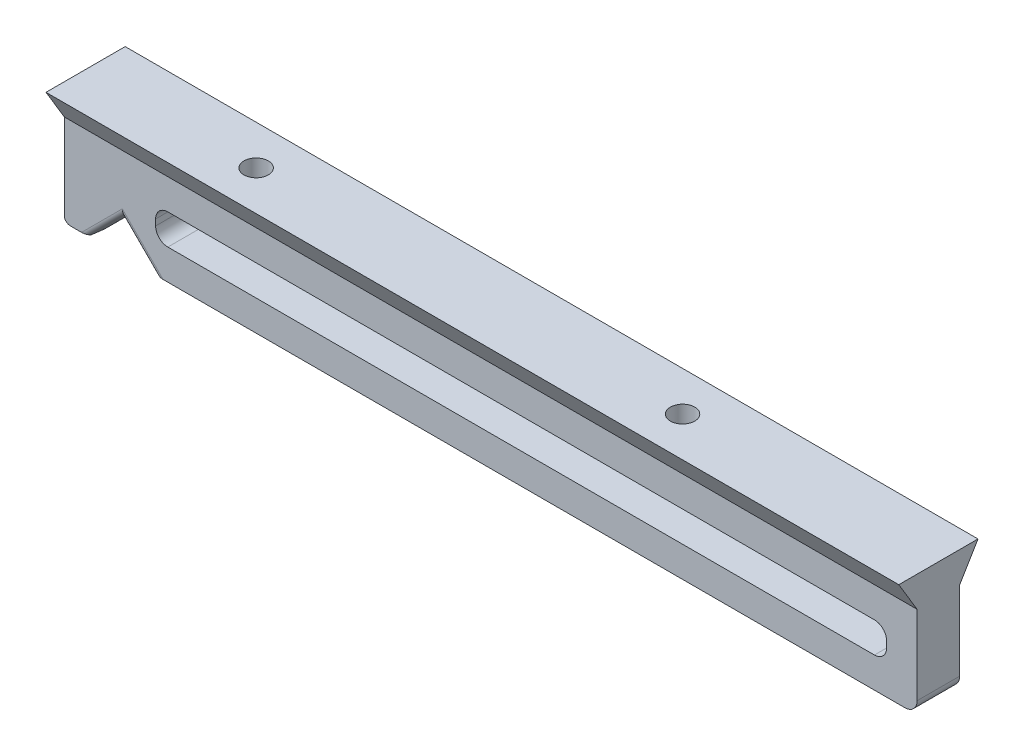
ISO-10303-21;
HEADER;
FILE_DESCRIPTION(('STEP AP214'),'2;1');
FILE_NAME('part.step','',(''),(''),'','','');
FILE_SCHEMA(('AUTOMOTIVE_DESIGN { 1 0 10303 214 1 1 1 1 }'));
ENDSEC;
DATA;
#1=APPLICATION_CONTEXT('core data for automotive mechanical design processes');
#2=APPLICATION_PROTOCOL_DEFINITION('international standard','automotive_design',2000,#1);
#3=PRODUCT_CONTEXT('',#1,'mechanical');
#4=PRODUCT('Part','Part','',(#3));
#5=PRODUCT_RELATED_PRODUCT_CATEGORY('part','',(#4));
#6=PRODUCT_DEFINITION_FORMATION('','',#4);
#7=PRODUCT_DEFINITION_CONTEXT('part definition',#1,'design');
#8=PRODUCT_DEFINITION('design','',#6,#7);
#9=PRODUCT_DEFINITION_SHAPE('','',#8);
#10=(LENGTH_UNIT() NAMED_UNIT(*) SI_UNIT(.MILLI.,.METRE.));
#11=(NAMED_UNIT(*) PLANE_ANGLE_UNIT() SI_UNIT($,.RADIAN.));
#12=(NAMED_UNIT(*) SI_UNIT($,.STERADIAN.) SOLID_ANGLE_UNIT());
#13=UNCERTAINTY_MEASURE_WITH_UNIT(LENGTH_MEASURE(1.E-05),#10,'distance_accuracy_value','');
#14=(GEOMETRIC_REPRESENTATION_CONTEXT(3) GLOBAL_UNCERTAINTY_ASSIGNED_CONTEXT((#13)) GLOBAL_UNIT_ASSIGNED_CONTEXT((#10,
#11,#12)) REPRESENTATION_CONTEXT('',''));
#15=CARTESIAN_POINT('',(0.,0.,0.));
#16=DIRECTION('',(0.,0.,1.));
#17=DIRECTION('',(1.,0.,0.));
#18=AXIS2_PLACEMENT_3D('',#15,#16,#17);
#19=CARTESIAN_POINT('',(-70.,20.,-3.5));
#20=DIRECTION('',(0.,0.,1.));
#21=DIRECTION('',(1.,0.,0.));
#22=AXIS2_PLACEMENT_3D('',#19,#20,#21);
#23=PLANE('',#22);
#24=DIRECTION('',(-1.,0.,0.));
#25=VECTOR('',#24,1.);
#26=CARTESIAN_POINT('',(65.,5.,-3.5));
#27=LINE('',#26,#25);
#28=CARTESIAN_POINT('',(63.,5.,-3.5));
#29=VERTEX_POINT('',#28);
#30=CARTESIAN_POINT('',(-53.,5.,-3.5));
#31=VERTEX_POINT('',#30);
#32=EDGE_CURVE('E523',#29,#31,#27,.T.);
#33=ORIENTED_EDGE('',*,*,#32,.F.);
#34=CARTESIAN_POINT('',(63.,7.,-3.5));
#35=DIRECTION('',(0.,0.,1.));
#36=DIRECTION('',(1.,0.,0.));
#37=AXIS2_PLACEMENT_3D('',#34,#35,#36);
#38=CIRCLE('',#37,2.);
#39=CARTESIAN_POINT('',(65.,7.,-3.5));
#40=VERTEX_POINT('',#39);
#41=EDGE_CURVE('E322',#29,#40,#38,.T.);
#42=ORIENTED_EDGE('',*,*,#41,.T.);
#43=DIRECTION('',(0.,-1.,0.));
#44=VECTOR('',#43,1.);
#45=CARTESIAN_POINT('',(65.,10.,-3.5));
#46=LINE('',#45,#44);
#47=CARTESIAN_POINT('',(65.,8.,-3.5));
#48=VERTEX_POINT('',#47);
#49=EDGE_CURVE('E517',#48,#40,#46,.T.);
#50=ORIENTED_EDGE('',*,*,#49,.F.);
#51=CARTESIAN_POINT('',(63.,8.,-3.5));
#52=DIRECTION('',(0.,0.,1.));
#53=DIRECTION('',(1.,0.,0.));
#54=AXIS2_PLACEMENT_3D('',#51,#52,#53);
#55=CIRCLE('',#54,2.);
#56=CARTESIAN_POINT('',(63.,10.,-3.5));
#57=VERTEX_POINT('',#56);
#58=EDGE_CURVE('E320',#48,#57,#55,.T.);
#59=ORIENTED_EDGE('',*,*,#58,.T.);
#60=DIRECTION('',(1.,0.,0.));
#61=VECTOR('',#60,1.);
#62=CARTESIAN_POINT('',(65.,10.,-3.5));
#63=LINE('',#62,#61);
#64=CARTESIAN_POINT('',(-53.,10.,-3.5));
#65=VERTEX_POINT('',#64);
#66=EDGE_CURVE('E385',#65,#57,#63,.T.);
#67=ORIENTED_EDGE('',*,*,#66,.F.);
#68=CARTESIAN_POINT('',(-53.,8.,-3.5));
#69=DIRECTION('',(0.,0.,1.));
#70=DIRECTION('',(1.,0.,0.));
#71=AXIS2_PLACEMENT_3D('',#68,#69,#70);
#72=CIRCLE('',#71,2.);
#73=CARTESIAN_POINT('',(-55.,8.,-3.5));
#74=VERTEX_POINT('',#73);
#75=EDGE_CURVE('E328',#65,#74,#72,.T.);
#76=ORIENTED_EDGE('',*,*,#75,.T.);
#77=DIRECTION('',(0.,1.,0.));
#78=VECTOR('',#77,1.);
#79=CARTESIAN_POINT('',(-55.,10.,-3.5));
#80=LINE('',#79,#78);
#81=CARTESIAN_POINT('',(-55.,7.,-3.5));
#82=VERTEX_POINT('',#81);
#83=EDGE_CURVE('E530',#82,#74,#80,.T.);
#84=ORIENTED_EDGE('',*,*,#83,.F.);
#85=CARTESIAN_POINT('',(-53.,7.,-3.5));
#86=DIRECTION('',(0.,0.,1.));
#87=DIRECTION('',(1.,0.,0.));
#88=AXIS2_PLACEMENT_3D('',#85,#86,#87);
#89=CIRCLE('',#88,2.);
#90=EDGE_CURVE('E323',#82,#31,#89,.T.);
#91=ORIENTED_EDGE('',*,*,#90,.T.);
#92=EDGE_LOOP('',(#33,#42,#50,#59,#67,#76,#84,#91));
#93=FACE_BOUND('',#92,.T.);
#94=DIRECTION('',(0.,-1.,0.));
#95=VECTOR('',#94,1.);
#96=CARTESIAN_POINT('',(70.,20.,-3.5));
#97=LINE('',#96,#95);
#98=CARTESIAN_POINT('',(70.,15.,-3.5));
#99=VERTEX_POINT('',#98);
#100=CARTESIAN_POINT('',(70.,2.,-3.5));
#101=VERTEX_POINT('',#100);
#102=EDGE_CURVE('E249',#99,#101,#97,.T.);
#103=ORIENTED_EDGE('',*,*,#102,.T.);
#104=CARTESIAN_POINT('',(68.,2.,-3.5));
#105=DIRECTION('',(0.,0.,1.));
#106=DIRECTION('',(1.,0.,0.));
#107=AXIS2_PLACEMENT_3D('',#104,#105,#106);
#108=CIRCLE('',#107,2.);
#109=CARTESIAN_POINT('',(68.,0.,-3.5));
#110=VERTEX_POINT('',#109);
#111=EDGE_CURVE('E62',#101,#110,#108,.F.);
#112=ORIENTED_EDGE('',*,*,#111,.T.);
#113=DIRECTION('',(-1.,0.,0.));
#114=VECTOR('',#113,1.);
#115=CARTESIAN_POINT('',(-70.,0.,-3.5));
#116=LINE('',#115,#114);
#117=CARTESIAN_POINT('',(-53.7757705796537,0.,-3.5));
#118=VERTEX_POINT('',#117);
#119=EDGE_CURVE('E364',#110,#118,#116,.T.);
#120=ORIENTED_EDGE('',*,*,#119,.T.);
#121=DIRECTION('',(-0.707106781186547,0.707106781186548,0.));
#122=VECTOR('',#121,1.);
#123=CARTESIAN_POINT('',(-71.8878852898269,18.1121147101732,-3.5));
#124=LINE('',#123,#122);
#125=CARTESIAN_POINT('',(-60.4736717274538,6.69790114780006,-3.5));
#126=VERTEX_POINT('',#125);
#127=EDGE_CURVE('E555',#118,#126,#124,.T.);
#128=ORIENTED_EDGE('',*,*,#127,.T.);
#129=DIRECTION('',(-0.707106781186548,-0.707106781186547,0.));
#130=VECTOR('',#129,1.);
#131=CARTESIAN_POINT('',(-58.5857864376269,8.5857864376269,-3.5));
#132=LINE('',#131,#130);
#133=CARTESIAN_POINT('',(-67.1715728752539,0.,-3.5));
#134=VERTEX_POINT('',#133);
#135=EDGE_CURVE('E554',#126,#134,#132,.T.);
#136=ORIENTED_EDGE('',*,*,#135,.T.);
#137=CARTESIAN_POINT('',(-69.,0.,-3.5));
#138=VERTEX_POINT('',#137);
#139=EDGE_CURVE('E366',#134,#138,#116,.T.);
#140=ORIENTED_EDGE('',*,*,#139,.T.);
#141=CARTESIAN_POINT('',(-69.,1.,-3.5));
#142=DIRECTION('',(0.,0.,1.));
#143=DIRECTION('',(1.,0.,0.));
#144=AXIS2_PLACEMENT_3D('',#141,#142,#143);
#145=CIRCLE('',#144,1.);
#146=CARTESIAN_POINT('',(-70.,1.,-3.5));
#147=VERTEX_POINT('',#146);
#148=EDGE_CURVE('E259',#138,#147,#145,.F.);
#149=ORIENTED_EDGE('',*,*,#148,.T.);
#150=DIRECTION('',(0.,-1.,0.));
#151=VECTOR('',#150,1.);
#152=CARTESIAN_POINT('',(-70.,20.,-3.5));
#153=LINE('',#152,#151);
#154=CARTESIAN_POINT('',(-70.,15.,-3.5));
#155=VERTEX_POINT('',#154);
#156=EDGE_CURVE('E348',#155,#147,#153,.T.);
#157=ORIENTED_EDGE('',*,*,#156,.F.);
#158=DIRECTION('',(-1.,0.,0.));
#159=VECTOR('',#158,1.);
#160=CARTESIAN_POINT('',(75.8309518948453,15.,-3.5));
#161=LINE('',#160,#159);
#162=EDGE_CURVE('E349',#99,#155,#161,.T.);
#163=ORIENTED_EDGE('',*,*,#162,.F.);
#164=EDGE_LOOP('',(#103,#112,#120,#128,#136,#140,#149,#157,#163));
#165=FACE_BOUND('',#164,.T.);
#166=ADVANCED_FACE('F39',(#93,#165),#23,.F.);
#167=CARTESIAN_POINT('',(0.,0.,0.));
#168=DIRECTION('',(0.,1.,0.));
#169=DIRECTION('',(0.,0.,1.));
#170=AXIS2_PLACEMENT_3D('',#167,#168,#169);
#171=PLANE('',#170);
#172=ORIENTED_EDGE('',*,*,#119,.F.);
#173=DIRECTION('',(0.,0.,-1.));
#174=VECTOR('',#173,1.);
#175=CARTESIAN_POINT('',(68.,0.,0.));
#176=LINE('',#175,#174);
#177=CARTESIAN_POINT('',(68.,0.,3.5));
#178=VERTEX_POINT('',#177);
#179=EDGE_CURVE('E50',#110,#178,#176,.F.);
#180=ORIENTED_EDGE('',*,*,#179,.T.);
#181=DIRECTION('',(1.,0.,0.));
#182=VECTOR('',#181,1.);
#183=CARTESIAN_POINT('',(-70.,0.,3.5));
#184=LINE('',#183,#182);
#185=CARTESIAN_POINT('',(-53.7757705796537,0.,3.5));
#186=VERTEX_POINT('',#185);
#187=EDGE_CURVE('E363',#186,#178,#184,.T.);
#188=ORIENTED_EDGE('',*,*,#187,.F.);
#189=CARTESIAN_POINT('',(-53.7757705796537,0.,2.5));
#190=DIRECTION('',(0.,1.,0.));
#191=DIRECTION('',(-1.,0.,0.));
#192=AXIS2_PLACEMENT_3D('',#189,#190,#191);
#193=ELLIPSE('',#192,1.41421356237309,1.);
#194=CARTESIAN_POINT('',(-55.0005154510453,0.,2.));
#195=VERTEX_POINT('',#194);
#196=EDGE_CURVE('E272',#186,#195,#193,.F.);
#197=ORIENTED_EDGE('',*,*,#196,.T.);
#198=CARTESIAN_POINT('',(-59.8994949366117,0.,0.));
#199=DIRECTION('',(0.,1.,0.));
#200=DIRECTION('',(-1.,0.,0.));
#201=AXIS2_PLACEMENT_3D('',#198,#199,#200);
#202=ELLIPSE('',#201,5.65685424949238,4.);
#203=CARTESIAN_POINT('',(-55.0005154510453,0.,-2.));
#204=VERTEX_POINT('',#203);
#205=EDGE_CURVE('E255',#195,#204,#202,.T.);
#206=ORIENTED_EDGE('',*,*,#205,.T.);
#207=CARTESIAN_POINT('',(-53.7757705796537,0.,-2.5));
#208=DIRECTION('',(0.,1.,0.));
#209=DIRECTION('',(-1.,0.,0.));
#210=AXIS2_PLACEMENT_3D('',#207,#208,#209);
#211=ELLIPSE('',#210,1.41421356237309,1.);
#212=EDGE_CURVE('E271',#204,#118,#211,.F.);
#213=ORIENTED_EDGE('',*,*,#212,.T.);
#214=EDGE_LOOP('',(#172,#180,#188,#197,#206,#213));
#215=FACE_BOUND('',#214,.T.);
#216=ADVANCED_FACE('F450',(#215),#171,.F.);
#217=CARTESIAN_POINT('',(70.,20.,-3.5));
#218=DIRECTION('',(-1.,0.,0.));
#219=DIRECTION('',(0.,0.,1.));
#220=AXIS2_PLACEMENT_3D('',#217,#218,#219);
#221=PLANE('',#220);
#222=DIRECTION('',(0.,-1.,0.));
#223=VECTOR('',#222,1.);
#224=CARTESIAN_POINT('',(70.,20.,3.5));
#225=LINE('',#224,#223);
#226=CARTESIAN_POINT('',(70.,15.,3.5));
#227=VERTEX_POINT('',#226);
#228=CARTESIAN_POINT('',(70.,2.,3.5));
#229=VERTEX_POINT('',#228);
#230=EDGE_CURVE('E341',#227,#229,#225,.T.);
#231=ORIENTED_EDGE('',*,*,#230,.T.);
#232=DIRECTION('',(0.,0.,-1.));
#233=VECTOR('',#232,1.);
#234=CARTESIAN_POINT('',(70.,2.,-3.5));
#235=LINE('',#234,#233);
#236=EDGE_CURVE('E334',#229,#101,#235,.T.);
#237=ORIENTED_EDGE('',*,*,#236,.T.);
#238=ORIENTED_EDGE('',*,*,#102,.F.);
#239=DIRECTION('',(0.,0.857492925712544,-0.514495755427526));
#240=VECTOR('',#239,1.);
#241=CARTESIAN_POINT('',(70.,20.,-6.5));
#242=LINE('',#241,#240);
#243=CARTESIAN_POINT('',(70.,20.,-6.5));
#244=VERTEX_POINT('',#243);
#245=EDGE_CURVE('E380',#99,#244,#242,.T.);
#246=ORIENTED_EDGE('',*,*,#245,.T.);
#247=DIRECTION('',(0.,0.,-1.));
#248=VECTOR('',#247,1.);
#249=CARTESIAN_POINT('',(70.,20.,-3.5));
#250=LINE('',#249,#248);
#251=CARTESIAN_POINT('',(70.,20.,6.5));
#252=VERTEX_POINT('',#251);
#253=EDGE_CURVE('E368',#252,#244,#250,.T.);
#254=ORIENTED_EDGE('',*,*,#253,.F.);
#255=DIRECTION('',(0.,-0.857492925712544,-0.514495755427526));
#256=VECTOR('',#255,1.);
#257=CARTESIAN_POINT('',(70.,20.,6.5));
#258=LINE('',#257,#256);
#259=EDGE_CURVE('E232',#252,#227,#258,.T.);
#260=ORIENTED_EDGE('',*,*,#259,.T.);
#261=EDGE_LOOP('',(#231,#237,#238,#246,#254,#260));
#262=FACE_BOUND('',#261,.T.);
#263=ADVANCED_FACE('F338',(#262),#221,.F.);
#264=CARTESIAN_POINT('',(-70.,20.,-3.5));
#265=DIRECTION('',(1.,0.,0.));
#266=DIRECTION('',(0.,0.,-1.));
#267=AXIS2_PLACEMENT_3D('',#264,#265,#266);
#268=PLANE('',#267);
#269=CARTESIAN_POINT('',(-70.,10.1005050633883,0.));
#270=DIRECTION('',(1.,0.,0.));
#271=DIRECTION('',(0.,1.,0.));
#272=AXIS2_PLACEMENT_3D('',#269,#270,#271);
#273=ELLIPSE('',#272,2.8284271247462,2.00000000000001);
#274=CARTESIAN_POINT('',(-70.,12.9289321881345,0.));
#275=VERTEX_POINT('',#274);
#276=EDGE_CURVE('E233',#275,#275,#273,.T.);
#277=ORIENTED_EDGE('',*,*,#276,.T.);
#278=EDGE_LOOP('',(#277));
#279=FACE_BOUND('',#278,.T.);
#280=ORIENTED_EDGE('',*,*,#156,.T.);
#281=DIRECTION('',(0.,0.,1.));
#282=VECTOR('',#281,1.);
#283=CARTESIAN_POINT('',(-70.,1.,-3.5));
#284=LINE('',#283,#282);
#285=CARTESIAN_POINT('',(-70.,1.,3.5));
#286=VERTEX_POINT('',#285);
#287=EDGE_CURVE('E213',#147,#286,#284,.T.);
#288=ORIENTED_EDGE('',*,*,#287,.T.);
#289=DIRECTION('',(0.,-1.,0.));
#290=VECTOR('',#289,1.);
#291=CARTESIAN_POINT('',(-70.,20.,3.5));
#292=LINE('',#291,#290);
#293=CARTESIAN_POINT('',(-70.,15.,3.5));
#294=VERTEX_POINT('',#293);
#295=EDGE_CURVE('E351',#294,#286,#292,.T.);
#296=ORIENTED_EDGE('',*,*,#295,.F.);
#297=DIRECTION('',(0.,0.857492925712544,0.514495755427526));
#298=VECTOR('',#297,1.);
#299=CARTESIAN_POINT('',(-70.,20.,6.5));
#300=LINE('',#299,#298);
#301=CARTESIAN_POINT('',(-70.,20.,6.5));
#302=VERTEX_POINT('',#301);
#303=EDGE_CURVE('E384',#294,#302,#300,.T.);
#304=ORIENTED_EDGE('',*,*,#303,.T.);
#305=DIRECTION('',(0.,0.,1.));
#306=VECTOR('',#305,1.);
#307=CARTESIAN_POINT('',(-70.,20.,-3.5));
#308=LINE('',#307,#306);
#309=CARTESIAN_POINT('',(-70.,20.,-6.5));
#310=VERTEX_POINT('',#309);
#311=EDGE_CURVE('E359',#310,#302,#308,.T.);
#312=ORIENTED_EDGE('',*,*,#311,.F.);
#313=DIRECTION('',(0.,-0.857492925712544,0.514495755427526));
#314=VECTOR('',#313,1.);
#315=CARTESIAN_POINT('',(-70.,20.,-6.5));
#316=LINE('',#315,#314);
#317=EDGE_CURVE('E387',#310,#155,#316,.T.);
#318=ORIENTED_EDGE('',*,*,#317,.T.);
#319=EDGE_LOOP('',(#280,#288,#296,#304,#312,#318));
#320=FACE_BOUND('',#319,.T.);
#321=ADVANCED_FACE('F448',(#279,#320),#268,.F.);
#322=CARTESIAN_POINT('',(-70.,20.,3.5));
#323=DIRECTION('',(0.,0.,-1.));
#324=DIRECTION('',(-1.,0.,0.));
#325=AXIS2_PLACEMENT_3D('',#322,#323,#324);
#326=PLANE('',#325);
#327=DIRECTION('',(0.,1.,0.));
#328=VECTOR('',#327,1.);
#329=CARTESIAN_POINT('',(-55.,20.,3.5));
#330=LINE('',#329,#328);
#331=CARTESIAN_POINT('',(-55.,7.,3.5));
#332=VERTEX_POINT('',#331);
#333=CARTESIAN_POINT('',(-55.,8.,3.5));
#334=VERTEX_POINT('',#333);
#335=EDGE_CURVE('E289',#332,#334,#330,.T.);
#336=ORIENTED_EDGE('',*,*,#335,.T.);
#337=CARTESIAN_POINT('',(-53.,8.,3.5));
#338=DIRECTION('',(0.,0.,-1.));
#339=DIRECTION('',(-1.,0.,0.));
#340=AXIS2_PLACEMENT_3D('',#337,#338,#339);
#341=CIRCLE('',#340,2.);
#342=CARTESIAN_POINT('',(-53.,10.,3.5));
#343=VERTEX_POINT('',#342);
#344=EDGE_CURVE('E331',#334,#343,#341,.T.);
#345=ORIENTED_EDGE('',*,*,#344,.T.);
#346=DIRECTION('',(1.,0.,0.));
#347=VECTOR('',#346,1.);
#348=CARTESIAN_POINT('',(-70.,10.,3.5));
#349=LINE('',#348,#347);
#350=CARTESIAN_POINT('',(63.,10.,3.5));
#351=VERTEX_POINT('',#350);
#352=EDGE_CURVE('E293',#343,#351,#349,.T.);
#353=ORIENTED_EDGE('',*,*,#352,.T.);
#354=CARTESIAN_POINT('',(63.,8.,3.5));
#355=DIRECTION('',(0.,0.,-1.));
#356=DIRECTION('',(-1.,0.,0.));
#357=AXIS2_PLACEMENT_3D('',#354,#355,#356);
#358=CIRCLE('',#357,2.);
#359=CARTESIAN_POINT('',(65.,8.,3.5));
#360=VERTEX_POINT('',#359);
#361=EDGE_CURVE('E316',#351,#360,#358,.T.);
#362=ORIENTED_EDGE('',*,*,#361,.T.);
#363=DIRECTION('',(0.,-1.,0.));
#364=VECTOR('',#363,1.);
#365=CARTESIAN_POINT('',(65.,20.,3.5));
#366=LINE('',#365,#364);
#367=CARTESIAN_POINT('',(65.,7.,3.5));
#368=VERTEX_POINT('',#367);
#369=EDGE_CURVE('E295',#360,#368,#366,.T.);
#370=ORIENTED_EDGE('',*,*,#369,.T.);
#371=CARTESIAN_POINT('',(63.,7.,3.5));
#372=DIRECTION('',(0.,0.,-1.));
#373=DIRECTION('',(-1.,0.,0.));
#374=AXIS2_PLACEMENT_3D('',#371,#372,#373);
#375=CIRCLE('',#374,2.);
#376=CARTESIAN_POINT('',(63.,5.,3.5));
#377=VERTEX_POINT('',#376);
#378=EDGE_CURVE('E324',#368,#377,#375,.T.);
#379=ORIENTED_EDGE('',*,*,#378,.T.);
#380=DIRECTION('',(-1.,0.,0.));
#381=VECTOR('',#380,1.);
#382=CARTESIAN_POINT('',(-70.,5.,3.5));
#383=LINE('',#382,#381);
#384=CARTESIAN_POINT('',(-53.,5.,3.5));
#385=VERTEX_POINT('',#384);
#386=EDGE_CURVE('E278',#377,#385,#383,.T.);
#387=ORIENTED_EDGE('',*,*,#386,.T.);
#388=CARTESIAN_POINT('',(-53.,7.,3.5));
#389=DIRECTION('',(0.,0.,-1.));
#390=DIRECTION('',(-1.,0.,0.));
#391=AXIS2_PLACEMENT_3D('',#388,#389,#390);
#392=CIRCLE('',#391,2.);
#393=EDGE_CURVE('E327',#385,#332,#392,.T.);
#394=ORIENTED_EDGE('',*,*,#393,.T.);
#395=EDGE_LOOP('',(#336,#345,#353,#362,#370,#379,#387,#394));
#396=FACE_BOUND('',#395,.T.);
#397=ORIENTED_EDGE('',*,*,#187,.T.);
#398=CARTESIAN_POINT('',(68.,2.,3.5));
#399=DIRECTION('',(0.,0.,-1.));
#400=DIRECTION('',(-1.,0.,0.));
#401=AXIS2_PLACEMENT_3D('',#398,#399,#400);
#402=CIRCLE('',#401,2.);
#403=EDGE_CURVE('E11',#178,#229,#402,.F.);
#404=ORIENTED_EDGE('',*,*,#403,.T.);
#405=ORIENTED_EDGE('',*,*,#230,.F.);
#406=DIRECTION('',(-1.,0.,0.));
#407=VECTOR('',#406,1.);
#408=CARTESIAN_POINT('',(75.8309518948453,15.,3.5));
#409=LINE('',#408,#407);
#410=EDGE_CURVE('E390',#227,#294,#409,.T.);
#411=ORIENTED_EDGE('',*,*,#410,.T.);
#412=ORIENTED_EDGE('',*,*,#295,.T.);
#413=CARTESIAN_POINT('',(-69.,1.,3.5));
#414=DIRECTION('',(0.,0.,-1.));
#415=DIRECTION('',(-1.,0.,0.));
#416=AXIS2_PLACEMENT_3D('',#413,#414,#415);
#417=CIRCLE('',#416,1.);
#418=CARTESIAN_POINT('',(-69.,0.,3.5));
#419=VERTEX_POINT('',#418);
#420=EDGE_CURVE('E546',#286,#419,#417,.F.);
#421=ORIENTED_EDGE('',*,*,#420,.T.);
#422=CARTESIAN_POINT('',(-67.1715728752539,0.,3.5));
#423=VERTEX_POINT('',#422);
#424=EDGE_CURVE('E361',#419,#423,#184,.T.);
#425=ORIENTED_EDGE('',*,*,#424,.T.);
#426=DIRECTION('',(0.707106781186548,0.707106781186547,0.));
#427=VECTOR('',#426,1.);
#428=CARTESIAN_POINT('',(-58.5857864376269,8.5857864376269,3.5));
#429=LINE('',#428,#427);
#430=CARTESIAN_POINT('',(-60.4736717274538,6.69790114780006,3.5));
#431=VERTEX_POINT('',#430);
#432=EDGE_CURVE('E545',#423,#431,#429,.T.);
#433=ORIENTED_EDGE('',*,*,#432,.T.);
#434=DIRECTION('',(-0.707106781186547,0.707106781186548,0.));
#435=VECTOR('',#434,1.);
#436=CARTESIAN_POINT('',(-71.8878852898269,18.1121147101732,3.5));
#437=LINE('',#436,#435);
#438=EDGE_CURVE('E565',#431,#186,#437,.F.);
#439=ORIENTED_EDGE('',*,*,#438,.T.);
#440=EDGE_LOOP('',(#397,#404,#405,#411,#412,#421,#425,#433,#439));
#441=FACE_BOUND('',#440,.T.);
#442=ADVANCED_FACE('F445',(#396,#441),#326,.F.);
#443=CARTESIAN_POINT('',(0.,20.,0.));
#444=DIRECTION('',(0.,1.,0.));
#445=DIRECTION('',(0.,0.,1.));
#446=AXIS2_PLACEMENT_3D('',#443,#444,#445);
#447=PLANE('',#446);
#448=CARTESIAN_POINT('',(-42.,20.,0.));
#449=DIRECTION('',(0.,1.,0.));
#450=DIRECTION('',(0.,0.,1.));
#451=AXIS2_PLACEMENT_3D('',#448,#449,#450);
#452=CIRCLE('',#451,2.);
#453=CARTESIAN_POINT('',(-42.,20.,2.));
#454=VERTEX_POINT('',#453);
#455=EDGE_CURVE('E376',#454,#454,#452,.T.);
#456=ORIENTED_EDGE('',*,*,#455,.F.);
#457=EDGE_LOOP('',(#456));
#458=FACE_BOUND('',#457,.T.);
#459=CARTESIAN_POINT('',(28.,20.,0.));
#460=DIRECTION('',(0.,1.,0.));
#461=DIRECTION('',(0.,0.,1.));
#462=AXIS2_PLACEMENT_3D('',#459,#460,#461);
#463=CIRCLE('',#462,2.);
#464=CARTESIAN_POINT('',(28.,20.,2.));
#465=VERTEX_POINT('',#464);
#466=EDGE_CURVE('E373',#465,#465,#463,.T.);
#467=ORIENTED_EDGE('',*,*,#466,.F.);
#468=EDGE_LOOP('',(#467));
#469=FACE_BOUND('',#468,.T.);
#470=ORIENTED_EDGE('',*,*,#253,.T.);
#471=DIRECTION('',(-1.,0.,0.));
#472=VECTOR('',#471,1.);
#473=CARTESIAN_POINT('',(75.8309518948453,20.,-6.5));
#474=LINE('',#473,#472);
#475=EDGE_CURVE('E395',#244,#310,#474,.T.);
#476=ORIENTED_EDGE('',*,*,#475,.T.);
#477=ORIENTED_EDGE('',*,*,#311,.T.);
#478=DIRECTION('',(-1.,0.,0.));
#479=VECTOR('',#478,1.);
#480=CARTESIAN_POINT('',(75.8309518948453,20.,6.5));
#481=LINE('',#480,#479);
#482=EDGE_CURVE('E389',#252,#302,#481,.T.);
#483=ORIENTED_EDGE('',*,*,#482,.F.);
#484=EDGE_LOOP('',(#470,#476,#477,#483));
#485=FACE_BOUND('',#484,.T.);
#486=ADVANCED_FACE('F437',(#458,#469,#485),#447,.T.);
#487=ORIENTED_EDGE('',*,*,#424,.F.);
#488=DIRECTION('',(0.,0.,1.));
#489=VECTOR('',#488,1.);
#490=CARTESIAN_POINT('',(-69.,0.,0.));
#491=LINE('',#490,#489);
#492=EDGE_CURVE('E549',#419,#138,#491,.F.);
#493=ORIENTED_EDGE('',*,*,#492,.T.);
#494=ORIENTED_EDGE('',*,*,#139,.F.);
#495=CARTESIAN_POINT('',(-67.1715728752539,0.,-2.5));
#496=DIRECTION('',(0.,1.,0.));
#497=DIRECTION('',(-1.,0.,0.));
#498=AXIS2_PLACEMENT_3D('',#495,#496,#497);
#499=ELLIPSE('',#498,1.4142135623731,1.);
#500=CARTESIAN_POINT('',(-66.036614644569,0.,-3.09660280530714));
#501=VERTEX_POINT('',#500);
#502=EDGE_CURVE('E541',#134,#501,#499,.F.);
#503=ORIENTED_EDGE('',*,*,#502,.T.);
#504=DIRECTION('',(0.,0.,1.));
#505=VECTOR('',#504,1.);
#506=CARTESIAN_POINT('',(-66.036614644569,0.,0.));
#507=LINE('',#506,#505);
#508=CARTESIAN_POINT('',(-66.036614644569,0.,3.09660280530713));
#509=VERTEX_POINT('',#508);
#510=EDGE_CURVE('E225',#501,#509,#507,.T.);
#511=ORIENTED_EDGE('',*,*,#510,.T.);
#512=CARTESIAN_POINT('',(-67.1715728752539,0.,2.5));
#513=DIRECTION('',(0.,1.,0.));
#514=DIRECTION('',(1.,0.,0.));
#515=AXIS2_PLACEMENT_3D('',#512,#513,#514);
#516=ELLIPSE('',#515,1.4142135623731,1.);
#517=EDGE_CURVE('E539',#509,#423,#516,.F.);
#518=ORIENTED_EDGE('',*,*,#517,.T.);
#519=EDGE_LOOP('',(#487,#493,#494,#503,#511,#518));
#520=FACE_BOUND('',#519,.T.);
#521=ADVANCED_FACE('F440',(#520),#171,.F.);
#522=CARTESIAN_POINT('',(28.,10.,0.));
#523=DIRECTION('',(0.,1.,0.));
#524=DIRECTION('',(0.,0.,1.));
#525=AXIS2_PLACEMENT_3D('',#522,#523,#524);
#526=CYLINDRICAL_SURFACE('',#525,2.);
#527=CARTESIAN_POINT('',(28.,10.,0.));
#528=DIRECTION('',(0.,1.,0.));
#529=DIRECTION('',(0.,0.,1.));
#530=AXIS2_PLACEMENT_3D('',#527,#528,#529);
#531=CIRCLE('',#530,2.);
#532=CARTESIAN_POINT('',(28.,10.,2.));
#533=VERTEX_POINT('',#532);
#534=EDGE_CURVE('E285',#533,#533,#531,.T.);
#535=ORIENTED_EDGE('',*,*,#534,.F.);
#536=EDGE_LOOP('',(#535));
#537=FACE_BOUND('',#536,.T.);
#538=ORIENTED_EDGE('',*,*,#466,.T.);
#539=EDGE_LOOP('',(#538));
#540=FACE_BOUND('',#539,.T.);
#541=ADVANCED_FACE('F433',(#537,#540),#526,.F.);
#542=CARTESIAN_POINT('',(-42.,10.,0.));
#543=DIRECTION('',(0.,1.,0.));
#544=DIRECTION('',(0.,0.,1.));
#545=AXIS2_PLACEMENT_3D('',#542,#543,#544);
#546=CYLINDRICAL_SURFACE('',#545,2.);
#547=CARTESIAN_POINT('',(-42.,10.,0.));
#548=DIRECTION('',(0.,1.,0.));
#549=DIRECTION('',(0.,0.,1.));
#550=AXIS2_PLACEMENT_3D('',#547,#548,#549);
#551=CIRCLE('',#550,2.);
#552=CARTESIAN_POINT('',(-42.,10.,2.));
#553=VERTEX_POINT('',#552);
#554=EDGE_CURVE('E375',#553,#553,#551,.T.);
#555=ORIENTED_EDGE('',*,*,#554,.F.);
#556=EDGE_LOOP('',(#555));
#557=FACE_BOUND('',#556,.T.);
#558=ORIENTED_EDGE('',*,*,#455,.T.);
#559=EDGE_LOOP('',(#558));
#560=FACE_BOUND('',#559,.T.);
#561=ADVANCED_FACE('F429',(#557,#560),#546,.F.);
#562=CARTESIAN_POINT('',(75.8309518948453,20.,6.5));
#563=DIRECTION('',(0.,-0.514495755427527,0.857492925712544));
#564=DIRECTION('',(0.,-0.857492925712544,-0.514495755427526));
#565=AXIS2_PLACEMENT_3D('',#562,#563,#564);
#566=PLANE('',#565);
#567=ORIENTED_EDGE('',*,*,#259,.F.);
#568=ORIENTED_EDGE('',*,*,#482,.T.);
#569=ORIENTED_EDGE('',*,*,#303,.F.);
#570=ORIENTED_EDGE('',*,*,#410,.F.);
#571=EDGE_LOOP('',(#567,#568,#569,#570));
#572=FACE_BOUND('',#571,.T.);
#573=ADVANCED_FACE('F424',(#572),#566,.T.);
#574=CARTESIAN_POINT('',(75.8309518948453,20.,-6.5));
#575=DIRECTION('',(0.,-0.514495755427527,-0.857492925712544));
#576=DIRECTION('',(0.,0.857492925712544,-0.514495755427526));
#577=AXIS2_PLACEMENT_3D('',#574,#575,#576);
#578=PLANE('',#577);
#579=ORIENTED_EDGE('',*,*,#245,.F.);
#580=ORIENTED_EDGE('',*,*,#162,.T.);
#581=ORIENTED_EDGE('',*,*,#317,.F.);
#582=ORIENTED_EDGE('',*,*,#475,.F.);
#583=EDGE_LOOP('',(#579,#580,#581,#582));
#584=FACE_BOUND('',#583,.T.);
#585=ADVANCED_FACE('F422',(#584),#578,.T.);
#586=CARTESIAN_POINT('',(5.05025253169412,-64.9497474683058,0.));
#587=DIRECTION('',(-0.707106781186548,0.707106781186548,0.));
#588=DIRECTION('',(-0.707106781186548,-0.707106781186547,0.));
#589=AXIS2_PLACEMENT_3D('',#586,#587,#588);
#590=CYLINDRICAL_SURFACE('',#589,2.00000000000001);
#591=CARTESIAN_POINT('',(-62.8284271247462,2.92893218813453,0.));
#592=DIRECTION('',(-0.707106781186547,0.707106781186548,0.));
#593=DIRECTION('',(-0.707106781186548,-0.707106781186547,0.));
#594=AXIS2_PLACEMENT_3D('',#591,#592,#593);
#595=CIRCLE('',#594,2.00000000000001);
#596=CARTESIAN_POINT('',(-64.1977335185091,1.55962579437162,-0.500000000000226));
#597=VERTEX_POINT('',#596);
#598=CARTESIAN_POINT('',(-64.1977335185091,1.55962579437162,0.500000000000226));
#599=VERTEX_POINT('',#598);
#600=EDGE_CURVE('E208',#597,#599,#595,.F.);
#601=ORIENTED_EDGE('',*,*,#600,.T.);
#602=CARTESIAN_POINT('',(-64.1977335185091,1.55962579437166,0.500000000000227));
#603=CARTESIAN_POINT('',(-64.2017805725702,1.55619331917412,0.479516962539039));
#604=CARTESIAN_POINT('',(-64.2055787759125,1.55297173501291,0.458949424054254));
#605=CARTESIAN_POINT('',(-64.2126691844545,1.54695758415615,0.417694732215152));
#606=CARTESIAN_POINT('',(-64.2159620797651,1.54416443234278,0.397007782766125));
#607=CARTESIAN_POINT('',(-64.2220405706567,1.53900844801786,0.355535585483894));
#608=CARTESIAN_POINT('',(-64.2248268568101,1.536645029725,0.334750511692076));
#609=CARTESIAN_POINT('',(-64.2298914419646,1.53234920005417,0.29310338353765));
#610=CARTESIAN_POINT('',(-64.2321704311119,1.53041620311333,0.272241473498304));
#611=CARTESIAN_POINT('',(-64.2362201835197,1.52698145509425,0.230461916079305));
#612=CARTESIAN_POINT('',(-64.2379916358456,1.52547911932054,0.209544383558041));
#613=CARTESIAN_POINT('',(-64.2410265636229,1.52290544483792,0.167674742806464));
#614=CARTESIAN_POINT('',(-64.2422907263563,1.52183352299781,0.146722720235463));
#615=CARTESIAN_POINT('',(-64.2443117954759,1.52011995607632,0.104805154033335));
#616=CARTESIAN_POINT('',(-64.245069386686,1.51947773009696,0.0838396671655369));
#617=CARTESIAN_POINT('',(-64.2460785027995,1.51862236508322,0.0419161013997034));
#618=CARTESIAN_POINT('',(-64.2463307094024,1.51840864804449,0.0209580506998517));
#619=CARTESIAN_POINT('',(-64.2463307094024,1.51840864804449,-0.0209580506998518));
#620=CARTESIAN_POINT('',(-64.2460785027995,1.51862236508322,-0.0419161013997035));
#621=CARTESIAN_POINT('',(-64.245069386686,1.51947773009696,-0.083839667165537));
#622=CARTESIAN_POINT('',(-64.2443117954759,1.52011995607632,-0.104805154033335));
#623=CARTESIAN_POINT('',(-64.2422907263563,1.52183352299781,-0.146722720235463));
#624=CARTESIAN_POINT('',(-64.2410265636229,1.52290544483792,-0.167674742806465));
#625=CARTESIAN_POINT('',(-64.2379916358456,1.52547911932054,-0.209544383558042));
#626=CARTESIAN_POINT('',(-64.2362201835197,1.52698145509425,-0.230461916079305));
#627=CARTESIAN_POINT('',(-64.2321704311119,1.53041620311333,-0.272241473498305));
#628=CARTESIAN_POINT('',(-64.2298914419646,1.53234920005417,-0.293103383537651));
#629=CARTESIAN_POINT('',(-64.2248268568101,1.536645029725,-0.334750511692076));
#630=CARTESIAN_POINT('',(-64.2220405706567,1.53900844801786,-0.355535585483894));
#631=CARTESIAN_POINT('',(-64.2159620797651,1.54416443234278,-0.397007782766125));
#632=CARTESIAN_POINT('',(-64.2126691844545,1.54695758415615,-0.417694732215153));
#633=CARTESIAN_POINT('',(-64.2055787759125,1.55297173501291,-0.458949424054254));
#634=CARTESIAN_POINT('',(-64.2017805725702,1.55619331917412,-0.479516962539039));
#635=CARTESIAN_POINT('',(-64.1977335185091,1.55962579437166,-0.500000000000227));
#636=B_SPLINE_CURVE_WITH_KNOTS('',3,(#602,#603,#604,#605,#606,#607,#608,#609,#610,#611,#612,
#613,#614,#615,#616,#617,#618,#619,#620,#621,#622,#623,#624,#625,#626,#627,#628,#629,#630,#631,
#632,#633,#634,#635),.UNSPECIFIED.,.F.,.F.,(4,2,2,2,2,2,2,2,2,2,2,2,2,2,2,2,4),(0.,
0.0634751658113155,0.126862855416586,0.190163480976738,0.253377456355857,0.316505197122399,
0.379547120550341,0.44250364562019,0.505375193019907,0.568246740419625,0.631203265489474,
0.694245188917415,0.757372929683958,0.820586905063077,0.883887530623229,0.947275220228499,
1.01075038603981),.UNSPECIFIED.);
#637=EDGE_CURVE('E218',#599,#597,#636,.T.);
#638=ORIENTED_EDGE('',*,*,#637,.T.);
#639=EDGE_LOOP('',(#601,#638));
#640=FACE_BOUND('',#639,.T.);
#641=ORIENTED_EDGE('',*,*,#276,.F.);
#642=EDGE_LOOP('',(#641));
#643=FACE_BOUND('',#642,.T.);
#644=ADVANCED_FACE('F230',(#640,#643),#590,.F.);
#645=CARTESIAN_POINT('',(-55.7573593128807,-4.14213562373094,0.));
#646=DIRECTION('',(-0.707106781186547,0.707106781186548,0.));
#647=DIRECTION('',(-0.707106781186548,-0.707106781186547,0.));
#648=AXIS2_PLACEMENT_3D('',#645,#646,#647);
#649=CYLINDRICAL_SURFACE('',#648,4.);
#650=CARTESIAN_POINT('',(-62.8284271247462,2.92893218813454,0.));
#651=DIRECTION('',(-0.707106781186547,0.707106781186548,0.));
#652=DIRECTION('',(-0.707106781186548,-0.707106781186547,0.));
#653=AXIS2_PLACEMENT_3D('',#650,#651,#652);
#654=CIRCLE('',#653,4.);
#655=CARTESIAN_POINT('',(-60.378937381963,5.37842193091772,2.));
#656=VERTEX_POINT('',#655);
#657=CARTESIAN_POINT('',(-60.378937381963,5.37842193091772,-2.));
#658=VERTEX_POINT('',#657);
#659=EDGE_CURVE('E235',#656,#658,#654,.T.);
#660=ORIENTED_EDGE('',*,*,#659,.T.);
#661=DIRECTION('',(-0.707106781186547,0.707106781186548,0.));
#662=VECTOR('',#661,1.);
#663=CARTESIAN_POINT('',(-53.3078695700976,-1.69264588094776,-2.));
#664=LINE('',#663,#662);
#665=EDGE_CURVE('E268',#658,#204,#664,.F.);
#666=ORIENTED_EDGE('',*,*,#665,.T.);
#667=ORIENTED_EDGE('',*,*,#205,.F.);
#668=DIRECTION('',(-0.707106781186547,0.707106781186548,0.));
#669=VECTOR('',#668,1.);
#670=CARTESIAN_POINT('',(-53.3078695700976,-1.69264588094776,2.));
#671=LINE('',#670,#669);
#672=EDGE_CURVE('E267',#195,#656,#671,.T.);
#673=ORIENTED_EDGE('',*,*,#672,.T.);
#674=EDGE_LOOP('',(#660,#666,#667,#673));
#675=FACE_BOUND('',#674,.T.);
#676=ADVANCED_FACE('F416',(#675),#649,.F.);
#677=CARTESIAN_POINT('',(-62.8284271247462,2.92893218813454,0.));
#678=DIRECTION('',(-0.707106781186547,0.707106781186548,0.));
#679=DIRECTION('',(-0.707106781186548,-0.707106781186547,0.));
#680=AXIS2_PLACEMENT_3D('',#677,#678,#679);
#681=PLANE('',#680);
#682=DIRECTION('',(0.,0.,-1.));
#683=VECTOR('',#682,1.);
#684=CARTESIAN_POINT('',(-64.1977335185091,1.55962579437166,0.));
#685=LINE('',#684,#683);
#686=CARTESIAN_POINT('',(-64.1977335185091,1.55962579437166,-2.5));
#687=VERTEX_POINT('',#686);
#688=EDGE_CURVE('E216',#597,#687,#685,.T.);
#689=ORIENTED_EDGE('',*,*,#688,.T.);
#690=DIRECTION('',(-0.707106781186548,-0.707106781186547,0.));
#691=VECTOR('',#690,1.);
#692=CARTESIAN_POINT('',(-62.8284271247462,2.92893218813454,-2.5));
#693=LINE('',#692,#691);
#694=CARTESIAN_POINT('',(-60.4736717274538,5.28368758542697,-2.5));
#695=VERTEX_POINT('',#694);
#696=EDGE_CURVE('E265',#687,#695,#693,.F.);
#697=ORIENTED_EDGE('',*,*,#696,.T.);
#698=CARTESIAN_POINT('',(-59.7665649462672,5.99079436661352,-2.5));
#699=DIRECTION('',(-0.707106781186547,0.707106781186548,0.));
#700=DIRECTION('',(-0.707106781186548,-0.707106781186547,0.));
#701=AXIS2_PLACEMENT_3D('',#698,#699,#700);
#702=CIRCLE('',#701,1.);
#703=EDGE_CURVE('E277',#695,#658,#702,.T.);
#704=ORIENTED_EDGE('',*,*,#703,.T.);
#705=ORIENTED_EDGE('',*,*,#659,.F.);
#706=CARTESIAN_POINT('',(-59.7665649462672,5.99079436661352,2.5));
#707=DIRECTION('',(-0.707106781186547,0.707106781186548,0.));
#708=DIRECTION('',(-0.707106781186548,-0.707106781186547,0.));
#709=AXIS2_PLACEMENT_3D('',#706,#707,#708);
#710=CIRCLE('',#709,1.);
#711=CARTESIAN_POINT('',(-60.4736717274538,5.28368758542697,2.5));
#712=VERTEX_POINT('',#711);
#713=EDGE_CURVE('E279',#656,#712,#710,.T.);
#714=ORIENTED_EDGE('',*,*,#713,.T.);
#715=DIRECTION('',(0.707106781186548,0.707106781186547,0.));
#716=VECTOR('',#715,1.);
#717=CARTESIAN_POINT('',(-62.8284271247462,2.92893218813454,2.5));
#718=LINE('',#717,#716);
#719=CARTESIAN_POINT('',(-64.1977335185091,1.55962579437166,2.5));
#720=VERTEX_POINT('',#719);
#721=EDGE_CURVE('E215',#712,#720,#718,.F.);
#722=ORIENTED_EDGE('',*,*,#721,.T.);
#723=EDGE_CURVE('E205',#720,#599,#685,.T.);
#724=ORIENTED_EDGE('',*,*,#723,.T.);
#725=ORIENTED_EDGE('',*,*,#600,.F.);
#726=EDGE_LOOP('',(#689,#697,#704,#705,#714,#722,#724,#725));
#727=FACE_BOUND('',#726,.T.);
#728=ADVANCED_FACE('F206',(#727),#681,.F.);
#729=CARTESIAN_POINT('',(-64.1977335185091,1.55962579437162,6.5));
#730=DIRECTION('',(-0.646823838682494,0.76263944410976,0.));
#731=DIRECTION('',(-0.76263944410976,-0.646823838682494,0.));
#732=AXIS2_PLACEMENT_3D('',#729,#730,#731);
#733=PLANE('',#732);
#734=ORIENTED_EDGE('',*,*,#510,.F.);
#735=CARTESIAN_POINT('',(-73.5102526827597,-6.33867980750581,-2.5));
#736=DIRECTION('',(-0.646823838682494,0.76263944410976,0.));
#737=DIRECTION('',(-0.76263944410976,-0.646823838682494,0.));
#738=AXIS2_PLACEMENT_3D('',#735,#736,#737);
#739=ELLIPSE('',#738,12.2109067871794,1.);
#740=EDGE_CURVE('E262',#501,#687,#739,.F.);
#741=ORIENTED_EDGE('',*,*,#740,.T.);
#742=ORIENTED_EDGE('',*,*,#688,.F.);
#743=ORIENTED_EDGE('',*,*,#637,.F.);
#744=ORIENTED_EDGE('',*,*,#723,.F.);
#745=CARTESIAN_POINT('',(-73.5102526827597,-6.33867980750581,2.5));
#746=DIRECTION('',(-0.646823838682494,0.76263944410976,0.));
#747=DIRECTION('',(0.76263944410976,0.646823838682494,0.));
#748=AXIS2_PLACEMENT_3D('',#745,#746,#747);
#749=ELLIPSE('',#748,12.2109067871794,1.);
#750=EDGE_CURVE('E258',#720,#509,#749,.F.);
#751=ORIENTED_EDGE('',*,*,#750,.T.);
#752=EDGE_LOOP('',(#734,#741,#742,#743,#744,#751));
#753=FACE_BOUND('',#752,.T.);
#754=ADVANCED_FACE('F222',(#753),#733,.F.);
#755=CARTESIAN_POINT('',(-69.,1.,-3.5));
#756=DIRECTION('',(0.,0.,1.));
#757=DIRECTION('',(1.,0.,0.));
#758=AXIS2_PLACEMENT_3D('',#755,#756,#757);
#759=CYLINDRICAL_SURFACE('',#758,1.);
#760=ORIENTED_EDGE('',*,*,#148,.F.);
#761=ORIENTED_EDGE('',*,*,#492,.F.);
#762=ORIENTED_EDGE('',*,*,#420,.F.);
#763=ORIENTED_EDGE('',*,*,#287,.F.);
#764=EDGE_LOOP('',(#760,#761,#762,#763));
#765=FACE_BOUND('',#764,.T.);
#766=ADVANCED_FACE('F411',(#765),#759,.T.);
#767=CARTESIAN_POINT('',(-52.6954971344018,-1.08027344525196,-2.5));
#768=DIRECTION('',(-0.707106781186547,0.707106781186548,0.));
#769=DIRECTION('',(-0.707106781186548,-0.707106781186547,0.));
#770=AXIS2_PLACEMENT_3D('',#767,#768,#769);
#771=CYLINDRICAL_SURFACE('',#770,1.);
#772=ORIENTED_EDGE('',*,*,#665,.F.);
#773=ORIENTED_EDGE('',*,*,#703,.F.);
#774=CARTESIAN_POINT('',(-60.4736717274538,6.69790114780006,-2.5));
#775=DIRECTION('',(-1.,0.,0.));
#776=DIRECTION('',(0.,-1.,0.));
#777=AXIS2_PLACEMENT_3D('',#774,#775,#776);
#778=ELLIPSE('',#777,1.41421356237309,1.);
#779=EDGE_CURVE('E228',#126,#695,#778,.T.);
#780=ORIENTED_EDGE('',*,*,#779,.F.);
#781=ORIENTED_EDGE('',*,*,#127,.F.);
#782=ORIENTED_EDGE('',*,*,#212,.F.);
#783=EDGE_LOOP('',(#772,#773,#780,#781,#782));
#784=FACE_BOUND('',#783,.T.);
#785=ADVANCED_FACE('F462',(#784),#771,.T.);
#786=CARTESIAN_POINT('',(-58.5857864376269,8.5857864376269,-2.5));
#787=DIRECTION('',(-0.707106781186548,-0.707106781186547,0.));
#788=DIRECTION('',(0.707106781186547,-0.707106781186548,0.));
#789=AXIS2_PLACEMENT_3D('',#786,#787,#788);
#790=CYLINDRICAL_SURFACE('',#789,1.);
#791=ORIENTED_EDGE('',*,*,#779,.T.);
#792=ORIENTED_EDGE('',*,*,#696,.F.);
#793=ORIENTED_EDGE('',*,*,#740,.F.);
#794=ORIENTED_EDGE('',*,*,#502,.F.);
#795=ORIENTED_EDGE('',*,*,#135,.F.);
#796=EDGE_LOOP('',(#791,#792,#793,#794,#795));
#797=FACE_BOUND('',#796,.T.);
#798=ADVANCED_FACE('F463',(#797),#790,.T.);
#799=CARTESIAN_POINT('',(-52.6954971344018,-1.08027344525196,2.5));
#800=DIRECTION('',(-0.707106781186547,0.707106781186548,0.));
#801=DIRECTION('',(-0.707106781186548,-0.707106781186547,0.));
#802=AXIS2_PLACEMENT_3D('',#799,#800,#801);
#803=CYLINDRICAL_SURFACE('',#802,1.);
#804=ORIENTED_EDGE('',*,*,#196,.F.);
#805=ORIENTED_EDGE('',*,*,#438,.F.);
#806=CARTESIAN_POINT('',(-60.4736717274538,6.69790114780006,2.5));
#807=DIRECTION('',(1.,0.,0.));
#808=DIRECTION('',(0.,1.,0.));
#809=AXIS2_PLACEMENT_3D('',#806,#807,#808);
#810=ELLIPSE('',#809,1.41421356237309,1.);
#811=EDGE_CURVE('E284',#712,#431,#810,.F.);
#812=ORIENTED_EDGE('',*,*,#811,.F.);
#813=ORIENTED_EDGE('',*,*,#713,.F.);
#814=ORIENTED_EDGE('',*,*,#672,.F.);
#815=EDGE_LOOP('',(#804,#805,#812,#813,#814));
#816=FACE_BOUND('',#815,.T.);
#817=ADVANCED_FACE('F470',(#816),#803,.T.);
#818=CARTESIAN_POINT('',(-58.5857864376269,8.5857864376269,2.5));
#819=DIRECTION('',(0.707106781186548,0.707106781186547,0.));
#820=DIRECTION('',(-0.707106781186547,0.707106781186548,0.));
#821=AXIS2_PLACEMENT_3D('',#818,#819,#820);
#822=CYLINDRICAL_SURFACE('',#821,1.);
#823=ORIENTED_EDGE('',*,*,#750,.F.);
#824=ORIENTED_EDGE('',*,*,#721,.F.);
#825=ORIENTED_EDGE('',*,*,#811,.T.);
#826=ORIENTED_EDGE('',*,*,#432,.F.);
#827=ORIENTED_EDGE('',*,*,#517,.F.);
#828=EDGE_LOOP('',(#823,#824,#825,#826,#827));
#829=FACE_BOUND('',#828,.T.);
#830=ADVANCED_FACE('F475',(#829),#822,.T.);
#831=CARTESIAN_POINT('',(65.,10.,6.5));
#832=DIRECTION('',(1.,0.,0.));
#833=DIRECTION('',(0.,0.,-1.));
#834=AXIS2_PLACEMENT_3D('',#831,#832,#833);
#835=PLANE('',#834);
#836=ORIENTED_EDGE('',*,*,#369,.F.);
#837=DIRECTION('',(0.,0.,-1.));
#838=VECTOR('',#837,1.);
#839=CARTESIAN_POINT('',(65.,8.,-3.5));
#840=LINE('',#839,#838);
#841=EDGE_CURVE('E299',#360,#48,#840,.T.);
#842=ORIENTED_EDGE('',*,*,#841,.T.);
#843=ORIENTED_EDGE('',*,*,#49,.T.);
#844=DIRECTION('',(0.,0.,-1.));
#845=VECTOR('',#844,1.);
#846=CARTESIAN_POINT('',(65.,7.,3.5));
#847=LINE('',#846,#845);
#848=EDGE_CURVE('E300',#40,#368,#847,.F.);
#849=ORIENTED_EDGE('',*,*,#848,.T.);
#850=EDGE_LOOP('',(#836,#842,#843,#849));
#851=FACE_BOUND('',#850,.T.);
#852=ADVANCED_FACE('F412',(#851),#835,.F.);
#853=CARTESIAN_POINT('',(65.,10.,6.5));
#854=DIRECTION('',(0.,1.,0.));
#855=DIRECTION('',(0.,0.,1.));
#856=AXIS2_PLACEMENT_3D('',#853,#854,#855);
#857=PLANE('',#856);
#858=ORIENTED_EDGE('',*,*,#534,.T.);
#859=EDGE_LOOP('',(#858));
#860=FACE_BOUND('',#859,.T.);
#861=ORIENTED_EDGE('',*,*,#554,.T.);
#862=EDGE_LOOP('',(#861));
#863=FACE_BOUND('',#862,.T.);
#864=ORIENTED_EDGE('',*,*,#66,.T.);
#865=DIRECTION('',(0.,0.,-1.));
#866=VECTOR('',#865,1.);
#867=CARTESIAN_POINT('',(63.,10.,3.5));
#868=LINE('',#867,#866);
#869=EDGE_CURVE('E304',#57,#351,#868,.F.);
#870=ORIENTED_EDGE('',*,*,#869,.T.);
#871=ORIENTED_EDGE('',*,*,#352,.F.);
#872=DIRECTION('',(0.,0.,-1.));
#873=VECTOR('',#872,1.);
#874=CARTESIAN_POINT('',(-53.,10.,-3.5));
#875=LINE('',#874,#873);
#876=EDGE_CURVE('E305',#343,#65,#875,.T.);
#877=ORIENTED_EDGE('',*,*,#876,.T.);
#878=EDGE_LOOP('',(#864,#870,#871,#877));
#879=FACE_BOUND('',#878,.T.);
#880=ADVANCED_FACE('F506',(#860,#863,#879),#857,.F.);
#881=CARTESIAN_POINT('',(-55.,10.,6.5));
#882=DIRECTION('',(-1.,0.,0.));
#883=DIRECTION('',(0.,0.,1.));
#884=AXIS2_PLACEMENT_3D('',#881,#882,#883);
#885=PLANE('',#884);
#886=ORIENTED_EDGE('',*,*,#335,.F.);
#887=DIRECTION('',(0.,0.,-1.));
#888=VECTOR('',#887,1.);
#889=CARTESIAN_POINT('',(-55.,7.,-3.5));
#890=LINE('',#889,#888);
#891=EDGE_CURVE('E313',#332,#82,#890,.T.);
#892=ORIENTED_EDGE('',*,*,#891,.T.);
#893=ORIENTED_EDGE('',*,*,#83,.T.);
#894=DIRECTION('',(0.,0.,-1.));
#895=VECTOR('',#894,1.);
#896=CARTESIAN_POINT('',(-55.,8.,3.5));
#897=LINE('',#896,#895);
#898=EDGE_CURVE('E315',#74,#334,#897,.F.);
#899=ORIENTED_EDGE('',*,*,#898,.T.);
#900=EDGE_LOOP('',(#886,#892,#893,#899));
#901=FACE_BOUND('',#900,.T.);
#902=ADVANCED_FACE('F527',(#901),#885,.F.);
#903=CARTESIAN_POINT('',(65.,5.,6.5));
#904=DIRECTION('',(0.,-1.,0.));
#905=DIRECTION('',(0.,0.,-1.));
#906=AXIS2_PLACEMENT_3D('',#903,#904,#905);
#907=PLANE('',#906);
#908=ORIENTED_EDGE('',*,*,#386,.F.);
#909=DIRECTION('',(0.,0.,-1.));
#910=VECTOR('',#909,1.);
#911=CARTESIAN_POINT('',(63.,5.,-3.5));
#912=LINE('',#911,#910);
#913=EDGE_CURVE('E307',#377,#29,#912,.T.);
#914=ORIENTED_EDGE('',*,*,#913,.T.);
#915=ORIENTED_EDGE('',*,*,#32,.T.);
#916=DIRECTION('',(0.,0.,-1.));
#917=VECTOR('',#916,1.);
#918=CARTESIAN_POINT('',(-53.,5.,3.5));
#919=LINE('',#918,#917);
#920=EDGE_CURVE('E310',#31,#385,#919,.F.);
#921=ORIENTED_EDGE('',*,*,#920,.T.);
#922=EDGE_LOOP('',(#908,#914,#915,#921));
#923=FACE_BOUND('',#922,.T.);
#924=ADVANCED_FACE('F484',(#923),#907,.F.);
#925=CARTESIAN_POINT('',(63.,8.,6.5));
#926=DIRECTION('',(0.,0.,1.));
#927=DIRECTION('',(1.,0.,0.));
#928=AXIS2_PLACEMENT_3D('',#925,#926,#927);
#929=CYLINDRICAL_SURFACE('',#928,2.);
#930=ORIENTED_EDGE('',*,*,#361,.F.);
#931=ORIENTED_EDGE('',*,*,#869,.F.);
#932=ORIENTED_EDGE('',*,*,#58,.F.);
#933=ORIENTED_EDGE('',*,*,#841,.F.);
#934=EDGE_LOOP('',(#930,#931,#932,#933));
#935=FACE_BOUND('',#934,.T.);
#936=ADVANCED_FACE('F478',(#935),#929,.F.);
#937=CARTESIAN_POINT('',(63.,7.,6.5));
#938=DIRECTION('',(0.,0.,1.));
#939=DIRECTION('',(1.,0.,0.));
#940=AXIS2_PLACEMENT_3D('',#937,#938,#939);
#941=CYLINDRICAL_SURFACE('',#940,2.);
#942=ORIENTED_EDGE('',*,*,#378,.F.);
#943=ORIENTED_EDGE('',*,*,#848,.F.);
#944=ORIENTED_EDGE('',*,*,#41,.F.);
#945=ORIENTED_EDGE('',*,*,#913,.F.);
#946=EDGE_LOOP('',(#942,#943,#944,#945));
#947=FACE_BOUND('',#946,.T.);
#948=ADVANCED_FACE('F482',(#947),#941,.F.);
#949=CARTESIAN_POINT('',(-53.,7.,6.5));
#950=DIRECTION('',(0.,0.,1.));
#951=DIRECTION('',(1.,0.,0.));
#952=AXIS2_PLACEMENT_3D('',#949,#950,#951);
#953=CYLINDRICAL_SURFACE('',#952,2.);
#954=ORIENTED_EDGE('',*,*,#393,.F.);
#955=ORIENTED_EDGE('',*,*,#920,.F.);
#956=ORIENTED_EDGE('',*,*,#90,.F.);
#957=ORIENTED_EDGE('',*,*,#891,.F.);
#958=EDGE_LOOP('',(#954,#955,#956,#957));
#959=FACE_BOUND('',#958,.T.);
#960=ADVANCED_FACE('F487',(#959),#953,.F.);
#961=CARTESIAN_POINT('',(-53.,8.,6.5));
#962=DIRECTION('',(0.,0.,1.));
#963=DIRECTION('',(1.,0.,0.));
#964=AXIS2_PLACEMENT_3D('',#961,#962,#963);
#965=CYLINDRICAL_SURFACE('',#964,2.);
#966=ORIENTED_EDGE('',*,*,#344,.F.);
#967=ORIENTED_EDGE('',*,*,#898,.F.);
#968=ORIENTED_EDGE('',*,*,#75,.F.);
#969=ORIENTED_EDGE('',*,*,#876,.F.);
#970=EDGE_LOOP('',(#966,#967,#968,#969));
#971=FACE_BOUND('',#970,.T.);
#972=ADVANCED_FACE('F489',(#971),#965,.F.);
#973=CARTESIAN_POINT('',(68.,2.,-3.5));
#974=DIRECTION('',(0.,0.,-1.));
#975=DIRECTION('',(-1.,0.,0.));
#976=AXIS2_PLACEMENT_3D('',#973,#974,#975);
#977=CYLINDRICAL_SURFACE('',#976,2.);
#978=ORIENTED_EDGE('',*,*,#403,.F.);
#979=ORIENTED_EDGE('',*,*,#179,.F.);
#980=ORIENTED_EDGE('',*,*,#111,.F.);
#981=ORIENTED_EDGE('',*,*,#236,.F.);
#982=EDGE_LOOP('',(#978,#979,#980,#981));
#983=FACE_BOUND('',#982,.T.);
#984=ADVANCED_FACE('F41',(#983),#977,.T.);
#985=CLOSED_SHELL('',(#166,#216,#263,#321,#442,#486,#521,#541,#561,#573,#585,#644,#676,#728,
#754,#766,#785,#798,#817,#830,#852,#880,#902,#924,#936,#948,#960,#972,#984));
#986=MANIFOLD_SOLID_BREP('B2',#985);
#987=ADVANCED_BREP_SHAPE_REPRESENTATION('',(#18,#986),#14);
#988=SHAPE_DEFINITION_REPRESENTATION(#9,#987);
ENDSEC;
END-ISO-10303-21;
